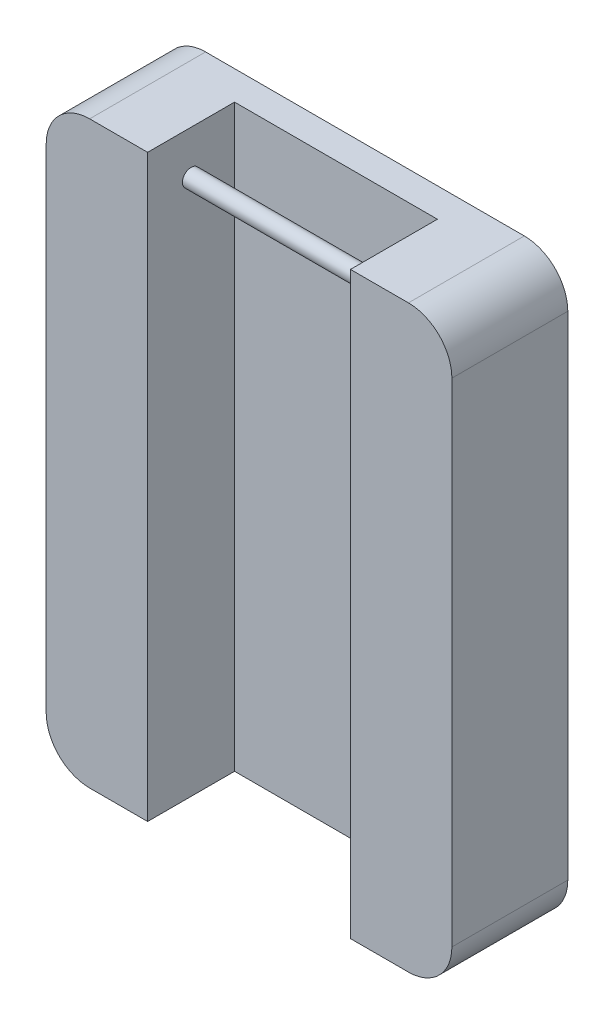
ISO-10303-21;
HEADER;
FILE_DESCRIPTION(('STEP AP214'),'2;1');
FILE_NAME('part.step','',(''),(''),'','','');
FILE_SCHEMA(('AUTOMOTIVE_DESIGN { 1 0 10303 214 1 1 1 1 }'));
ENDSEC;
DATA;
#1=APPLICATION_CONTEXT('core data for automotive mechanical design processes');
#2=APPLICATION_PROTOCOL_DEFINITION('international standard','automotive_design',2000,#1);
#3=PRODUCT_CONTEXT('',#1,'mechanical');
#4=PRODUCT('Part','Part','',(#3));
#5=PRODUCT_RELATED_PRODUCT_CATEGORY('part','',(#4));
#6=PRODUCT_DEFINITION_FORMATION('','',#4);
#7=PRODUCT_DEFINITION_CONTEXT('part definition',#1,'design');
#8=PRODUCT_DEFINITION('design','',#6,#7);
#9=PRODUCT_DEFINITION_SHAPE('','',#8);
#10=(LENGTH_UNIT() NAMED_UNIT(*) SI_UNIT(.MILLI.,.METRE.));
#11=(NAMED_UNIT(*) PLANE_ANGLE_UNIT() SI_UNIT($,.RADIAN.));
#12=(NAMED_UNIT(*) SI_UNIT($,.STERADIAN.) SOLID_ANGLE_UNIT());
#13=UNCERTAINTY_MEASURE_WITH_UNIT(LENGTH_MEASURE(1.E-05),#10,'distance_accuracy_value','');
#14=(GEOMETRIC_REPRESENTATION_CONTEXT(3) GLOBAL_UNCERTAINTY_ASSIGNED_CONTEXT((#13)) GLOBAL_UNIT_ASSIGNED_CONTEXT((#10,
#11,#12)) REPRESENTATION_CONTEXT('',''));
#15=CARTESIAN_POINT('',(0.,0.,0.));
#16=DIRECTION('',(0.,0.,1.));
#17=DIRECTION('',(1.,0.,0.));
#18=AXIS2_PLACEMENT_3D('',#15,#16,#17);
#19=CARTESIAN_POINT('',(-55.,85.,40.));
#20=DIRECTION('',(0.,0.,-1.));
#21=DIRECTION('',(-1.,0.,0.));
#22=AXIS2_PLACEMENT_3D('',#19,#20,#21);
#23=PLANE('',#22);
#24=DIRECTION('',(-1.,0.,0.));
#25=VECTOR('',#24,1.);
#26=CARTESIAN_POINT('',(54.9999999999999,100.,40.));
#27=LINE('',#26,#25);
#28=CARTESIAN_POINT('',(54.9999999999999,100.,40.));
#29=VERTEX_POINT('',#28);
#30=CARTESIAN_POINT('',(35.,100.,40.));
#31=VERTEX_POINT('',#30);
#32=EDGE_CURVE('E221',#29,#31,#27,.T.);
#33=ORIENTED_EDGE('',*,*,#32,.T.);
#34=DIRECTION('',(0.,1.,0.));
#35=VECTOR('',#34,1.);
#36=CARTESIAN_POINT('',(35.,-100.,40.));
#37=LINE('',#36,#35);
#38=CARTESIAN_POINT('',(35.,-100.,40.));
#39=VERTEX_POINT('',#38);
#40=EDGE_CURVE('E200',#39,#31,#37,.T.);
#41=ORIENTED_EDGE('',*,*,#40,.F.);
#42=DIRECTION('',(1.,0.,0.));
#43=VECTOR('',#42,1.);
#44=CARTESIAN_POINT('',(-54.9999999999999,-100.,40.));
#45=LINE('',#44,#43);
#46=CARTESIAN_POINT('',(54.9999999999999,-100.,40.));
#47=VERTEX_POINT('',#46);
#48=EDGE_CURVE('E125',#39,#47,#45,.T.);
#49=ORIENTED_EDGE('',*,*,#48,.T.);
#50=CARTESIAN_POINT('',(55.,-85.,40.));
#51=DIRECTION('',(0.,0.,1.));
#52=DIRECTION('',(1.,0.,0.));
#53=AXIS2_PLACEMENT_3D('',#50,#51,#52);
#54=CIRCLE('',#53,15.);
#55=CARTESIAN_POINT('',(70.,-85.,40.));
#56=VERTEX_POINT('',#55);
#57=EDGE_CURVE('E118',#47,#56,#54,.T.);
#58=ORIENTED_EDGE('',*,*,#57,.T.);
#59=DIRECTION('',(0.,1.,0.));
#60=VECTOR('',#59,1.);
#61=CARTESIAN_POINT('',(70.,-84.9999999999999,40.));
#62=LINE('',#61,#60);
#63=CARTESIAN_POINT('',(70.,84.9999999999999,40.));
#64=VERTEX_POINT('',#63);
#65=EDGE_CURVE('E121',#56,#64,#62,.T.);
#66=ORIENTED_EDGE('',*,*,#65,.T.);
#67=CARTESIAN_POINT('',(55.,85.,40.));
#68=DIRECTION('',(0.,0.,1.));
#69=DIRECTION('',(1.,0.,0.));
#70=AXIS2_PLACEMENT_3D('',#67,#68,#69);
#71=CIRCLE('',#70,15.);
#72=EDGE_CURVE('E60',#64,#29,#71,.T.);
#73=ORIENTED_EDGE('',*,*,#72,.T.);
#74=EDGE_LOOP('',(#33,#41,#49,#58,#66,#73));
#75=FACE_BOUND('',#74,.T.);
#76=ADVANCED_FACE('F35',(#75),#23,.F.);
#77=CARTESIAN_POINT('',(0.,100.,40.));
#78=DIRECTION('',(0.,-1.,0.));
#79=DIRECTION('',(0.,0.,-1.));
#80=AXIS2_PLACEMENT_3D('',#77,#78,#79);
#81=PLANE('',#80);
#82=DIRECTION('',(-1.,0.,0.));
#83=VECTOR('',#82,1.);
#84=CARTESIAN_POINT('',(35.,100.,10.));
#85=LINE('',#84,#83);
#86=CARTESIAN_POINT('',(35.,100.,10.));
#87=VERTEX_POINT('',#86);
#88=CARTESIAN_POINT('',(-35.,100.,10.));
#89=VERTEX_POINT('',#88);
#90=EDGE_CURVE('E230',#87,#89,#85,.T.);
#91=ORIENTED_EDGE('',*,*,#90,.F.);
#92=DIRECTION('',(0.,0.,1.));
#93=VECTOR('',#92,1.);
#94=CARTESIAN_POINT('',(35.,100.,10.));
#95=LINE('',#94,#93);
#96=EDGE_CURVE('E150',#87,#31,#95,.T.);
#97=ORIENTED_EDGE('',*,*,#96,.T.);
#98=ORIENTED_EDGE('',*,*,#32,.F.);
#99=DIRECTION('',(0.,0.,-1.));
#100=VECTOR('',#99,1.);
#101=CARTESIAN_POINT('',(54.9999999999999,100.,40.));
#102=LINE('',#101,#100);
#103=CARTESIAN_POINT('',(54.9999999999999,100.,0.));
#104=VERTEX_POINT('',#103);
#105=EDGE_CURVE('E144',#29,#104,#102,.T.);
#106=ORIENTED_EDGE('',*,*,#105,.T.);
#107=DIRECTION('',(-1.,0.,0.));
#108=VECTOR('',#107,1.);
#109=CARTESIAN_POINT('',(0.,100.,0.));
#110=LINE('',#109,#108);
#111=CARTESIAN_POINT('',(-54.9999999999999,100.,0.));
#112=VERTEX_POINT('',#111);
#113=EDGE_CURVE('E93',#104,#112,#110,.T.);
#114=ORIENTED_EDGE('',*,*,#113,.T.);
#115=DIRECTION('',(0.,0.,-1.));
#116=VECTOR('',#115,1.);
#117=CARTESIAN_POINT('',(-54.9999999999999,100.,40.));
#118=LINE('',#117,#116);
#119=CARTESIAN_POINT('',(-54.9999999999999,100.,40.));
#120=VERTEX_POINT('',#119);
#121=EDGE_CURVE('E175',#120,#112,#118,.T.);
#122=ORIENTED_EDGE('',*,*,#121,.F.);
#123=CARTESIAN_POINT('',(-35.,100.,40.));
#124=VERTEX_POINT('',#123);
#125=EDGE_CURVE('E101',#124,#120,#27,.T.);
#126=ORIENTED_EDGE('',*,*,#125,.F.);
#127=DIRECTION('',(0.,0.,1.));
#128=VECTOR('',#127,1.);
#129=CARTESIAN_POINT('',(-35.,100.,10.));
#130=LINE('',#129,#128);
#131=EDGE_CURVE('E51',#89,#124,#130,.T.);
#132=ORIENTED_EDGE('',*,*,#131,.F.);
#133=EDGE_LOOP('',(#91,#97,#98,#106,#114,#122,#126,#132));
#134=FACE_BOUND('',#133,.T.);
#135=ADVANCED_FACE('F37',(#134),#81,.F.);
#136=CARTESIAN_POINT('',(-55.,85.,40.));
#137=DIRECTION('',(0.,0.,-1.));
#138=DIRECTION('',(-1.,0.,0.));
#139=AXIS2_PLACEMENT_3D('',#136,#137,#138);
#140=CYLINDRICAL_SURFACE('',#139,15.);
#141=CARTESIAN_POINT('',(-55.,85.,0.));
#142=DIRECTION('',(0.,0.,1.));
#143=DIRECTION('',(-1.,0.,0.));
#144=AXIS2_PLACEMENT_3D('',#141,#142,#143);
#145=CIRCLE('',#144,15.);
#146=CARTESIAN_POINT('',(-70.,84.9999999999999,0.));
#147=VERTEX_POINT('',#146);
#148=EDGE_CURVE('E149',#112,#147,#145,.T.);
#149=ORIENTED_EDGE('',*,*,#148,.T.);
#150=DIRECTION('',(0.,0.,-1.));
#151=VECTOR('',#150,1.);
#152=CARTESIAN_POINT('',(-70.,84.9999999999999,40.));
#153=LINE('',#152,#151);
#154=CARTESIAN_POINT('',(-70.,84.9999999999999,40.));
#155=VERTEX_POINT('',#154);
#156=EDGE_CURVE('E173',#155,#147,#153,.T.);
#157=ORIENTED_EDGE('',*,*,#156,.F.);
#158=CARTESIAN_POINT('',(-55.,85.,40.));
#159=DIRECTION('',(0.,0.,1.));
#160=DIRECTION('',(-1.,0.,0.));
#161=AXIS2_PLACEMENT_3D('',#158,#159,#160);
#162=CIRCLE('',#161,15.);
#163=EDGE_CURVE('E219',#120,#155,#162,.T.);
#164=ORIENTED_EDGE('',*,*,#163,.F.);
#165=ORIENTED_EDGE('',*,*,#121,.T.);
#166=EDGE_LOOP('',(#149,#157,#164,#165));
#167=FACE_BOUND('',#166,.T.);
#168=ADVANCED_FACE('F245',(#167),#140,.T.);
#169=CARTESIAN_POINT('',(-70.,84.9999999999999,40.));
#170=DIRECTION('',(1.,0.,0.));
#171=DIRECTION('',(0.,0.,-1.));
#172=AXIS2_PLACEMENT_3D('',#169,#170,#171);
#173=PLANE('',#172);
#174=DIRECTION('',(0.,-1.,0.));
#175=VECTOR('',#174,1.);
#176=CARTESIAN_POINT('',(-70.,84.9999999999999,0.));
#177=LINE('',#176,#175);
#178=CARTESIAN_POINT('',(-70.,-84.9999999999999,0.));
#179=VERTEX_POINT('',#178);
#180=EDGE_CURVE('E152',#147,#179,#177,.T.);
#181=ORIENTED_EDGE('',*,*,#180,.T.);
#182=DIRECTION('',(0.,0.,-1.));
#183=VECTOR('',#182,1.);
#184=CARTESIAN_POINT('',(-70.,-84.9999999999999,40.));
#185=LINE('',#184,#183);
#186=CARTESIAN_POINT('',(-70.,-84.9999999999999,40.));
#187=VERTEX_POINT('',#186);
#188=EDGE_CURVE('E170',#187,#179,#185,.T.);
#189=ORIENTED_EDGE('',*,*,#188,.F.);
#190=DIRECTION('',(0.,-1.,0.));
#191=VECTOR('',#190,1.);
#192=CARTESIAN_POINT('',(-70.,84.9999999999999,40.));
#193=LINE('',#192,#191);
#194=EDGE_CURVE('E217',#155,#187,#193,.T.);
#195=ORIENTED_EDGE('',*,*,#194,.F.);
#196=ORIENTED_EDGE('',*,*,#156,.T.);
#197=EDGE_LOOP('',(#181,#189,#195,#196));
#198=FACE_BOUND('',#197,.T.);
#199=ADVANCED_FACE('F249',(#198),#173,.F.);
#200=CARTESIAN_POINT('',(-55.,-85.,40.));
#201=DIRECTION('',(0.,0.,-1.));
#202=DIRECTION('',(-1.,0.,0.));
#203=AXIS2_PLACEMENT_3D('',#200,#201,#202);
#204=CYLINDRICAL_SURFACE('',#203,15.);
#205=CARTESIAN_POINT('',(-55.,-85.,0.));
#206=DIRECTION('',(0.,0.,1.));
#207=DIRECTION('',(1.,0.,0.));
#208=AXIS2_PLACEMENT_3D('',#205,#206,#207);
#209=CIRCLE('',#208,15.);
#210=CARTESIAN_POINT('',(-54.9999999999999,-100.,0.));
#211=VERTEX_POINT('',#210);
#212=EDGE_CURVE('E154',#179,#211,#209,.T.);
#213=ORIENTED_EDGE('',*,*,#212,.T.);
#214=DIRECTION('',(0.,0.,-1.));
#215=VECTOR('',#214,1.);
#216=CARTESIAN_POINT('',(-54.9999999999999,-100.,40.));
#217=LINE('',#216,#215);
#218=CARTESIAN_POINT('',(-54.9999999999999,-100.,40.));
#219=VERTEX_POINT('',#218);
#220=EDGE_CURVE('E167',#219,#211,#217,.T.);
#221=ORIENTED_EDGE('',*,*,#220,.F.);
#222=CARTESIAN_POINT('',(-55.,-85.,40.));
#223=DIRECTION('',(0.,0.,1.));
#224=DIRECTION('',(1.,0.,0.));
#225=AXIS2_PLACEMENT_3D('',#222,#223,#224);
#226=CIRCLE('',#225,15.);
#227=EDGE_CURVE('E213',#187,#219,#226,.T.);
#228=ORIENTED_EDGE('',*,*,#227,.F.);
#229=ORIENTED_EDGE('',*,*,#188,.T.);
#230=EDGE_LOOP('',(#213,#221,#228,#229));
#231=FACE_BOUND('',#230,.T.);
#232=ADVANCED_FACE('F253',(#231),#204,.T.);
#233=CARTESIAN_POINT('',(-54.9999999999999,-100.,40.));
#234=DIRECTION('',(0.,1.,0.));
#235=DIRECTION('',(0.,0.,1.));
#236=AXIS2_PLACEMENT_3D('',#233,#234,#235);
#237=PLANE('',#236);
#238=ORIENTED_EDGE('',*,*,#48,.F.);
#239=DIRECTION('',(0.,0.,1.));
#240=VECTOR('',#239,1.);
#241=CARTESIAN_POINT('',(35.,-100.,10.));
#242=LINE('',#241,#240);
#243=CARTESIAN_POINT('',(35.,-100.,10.));
#244=VERTEX_POINT('',#243);
#245=EDGE_CURVE('E209',#244,#39,#242,.T.);
#246=ORIENTED_EDGE('',*,*,#245,.F.);
#247=DIRECTION('',(1.,0.,0.));
#248=VECTOR('',#247,1.);
#249=CARTESIAN_POINT('',(-35.,-100.,10.));
#250=LINE('',#249,#248);
#251=CARTESIAN_POINT('',(-35.,-100.,10.));
#252=VERTEX_POINT('',#251);
#253=EDGE_CURVE('E208',#252,#244,#250,.T.);
#254=ORIENTED_EDGE('',*,*,#253,.F.);
#255=DIRECTION('',(0.,0.,1.));
#256=VECTOR('',#255,1.);
#257=CARTESIAN_POINT('',(-35.,-100.,10.));
#258=LINE('',#257,#256);
#259=CARTESIAN_POINT('',(-35.,-100.,40.));
#260=VERTEX_POINT('',#259);
#261=EDGE_CURVE('E195',#252,#260,#258,.T.);
#262=ORIENTED_EDGE('',*,*,#261,.T.);
#263=EDGE_CURVE('E129',#219,#260,#45,.T.);
#264=ORIENTED_EDGE('',*,*,#263,.F.);
#265=ORIENTED_EDGE('',*,*,#220,.T.);
#266=DIRECTION('',(1.,0.,0.));
#267=VECTOR('',#266,1.);
#268=CARTESIAN_POINT('',(-54.9999999999999,-100.,0.));
#269=LINE('',#268,#267);
#270=CARTESIAN_POINT('',(54.9999999999999,-100.,0.));
#271=VERTEX_POINT('',#270);
#272=EDGE_CURVE('E156',#211,#271,#269,.T.);
#273=ORIENTED_EDGE('',*,*,#272,.T.);
#274=DIRECTION('',(0.,0.,-1.));
#275=VECTOR('',#274,1.);
#276=CARTESIAN_POINT('',(54.9999999999999,-100.,40.));
#277=LINE('',#276,#275);
#278=EDGE_CURVE('E138',#47,#271,#277,.T.);
#279=ORIENTED_EDGE('',*,*,#278,.F.);
#280=EDGE_LOOP('',(#238,#246,#254,#262,#264,#265,#273,#279));
#281=FACE_BOUND('',#280,.T.);
#282=ADVANCED_FACE('F205',(#281),#237,.F.);
#283=CARTESIAN_POINT('',(55.,-85.,40.));
#284=DIRECTION('',(0.,0.,-1.));
#285=DIRECTION('',(-1.,0.,0.));
#286=AXIS2_PLACEMENT_3D('',#283,#284,#285);
#287=CYLINDRICAL_SURFACE('',#286,15.);
#288=CARTESIAN_POINT('',(55.,-85.,0.));
#289=DIRECTION('',(0.,0.,1.));
#290=DIRECTION('',(1.,0.,0.));
#291=AXIS2_PLACEMENT_3D('',#288,#289,#290);
#292=CIRCLE('',#291,15.);
#293=CARTESIAN_POINT('',(70.,-85.,0.));
#294=VERTEX_POINT('',#293);
#295=EDGE_CURVE('E135',#271,#294,#292,.T.);
#296=ORIENTED_EDGE('',*,*,#295,.T.);
#297=DIRECTION('',(0.,0.,-1.));
#298=VECTOR('',#297,1.);
#299=CARTESIAN_POINT('',(70.,-85.,40.));
#300=LINE('',#299,#298);
#301=EDGE_CURVE('E132',#56,#294,#300,.T.);
#302=ORIENTED_EDGE('',*,*,#301,.F.);
#303=ORIENTED_EDGE('',*,*,#57,.F.);
#304=ORIENTED_EDGE('',*,*,#278,.T.);
#305=EDGE_LOOP('',(#296,#302,#303,#304));
#306=FACE_BOUND('',#305,.T.);
#307=ADVANCED_FACE('F133',(#306),#287,.T.);
#308=CARTESIAN_POINT('',(70.,-84.9999999999999,40.));
#309=DIRECTION('',(-1.,0.,0.));
#310=DIRECTION('',(0.,0.,1.));
#311=AXIS2_PLACEMENT_3D('',#308,#309,#310);
#312=PLANE('',#311);
#313=DIRECTION('',(0.,1.,0.));
#314=VECTOR('',#313,1.);
#315=CARTESIAN_POINT('',(70.,-84.9999999999999,0.));
#316=LINE('',#315,#314);
#317=CARTESIAN_POINT('',(70.,84.9999999999999,0.));
#318=VERTEX_POINT('',#317);
#319=EDGE_CURVE('E159',#294,#318,#316,.T.);
#320=ORIENTED_EDGE('',*,*,#319,.T.);
#321=DIRECTION('',(0.,0.,-1.));
#322=VECTOR('',#321,1.);
#323=CARTESIAN_POINT('',(70.,84.9999999999999,40.));
#324=LINE('',#323,#322);
#325=EDGE_CURVE('E139',#64,#318,#324,.T.);
#326=ORIENTED_EDGE('',*,*,#325,.F.);
#327=ORIENTED_EDGE('',*,*,#65,.F.);
#328=ORIENTED_EDGE('',*,*,#301,.T.);
#329=EDGE_LOOP('',(#320,#326,#327,#328));
#330=FACE_BOUND('',#329,.T.);
#331=ADVANCED_FACE('F141',(#330),#312,.F.);
#332=CARTESIAN_POINT('',(55.,85.,40.));
#333=DIRECTION('',(0.,0.,-1.));
#334=DIRECTION('',(-1.,0.,0.));
#335=AXIS2_PLACEMENT_3D('',#332,#333,#334);
#336=CYLINDRICAL_SURFACE('',#335,15.);
#337=CARTESIAN_POINT('',(55.,85.,0.));
#338=DIRECTION('',(0.,0.,1.));
#339=DIRECTION('',(1.,0.,0.));
#340=AXIS2_PLACEMENT_3D('',#337,#338,#339);
#341=CIRCLE('',#340,15.);
#342=EDGE_CURVE('E161',#318,#104,#341,.T.);
#343=ORIENTED_EDGE('',*,*,#342,.T.);
#344=ORIENTED_EDGE('',*,*,#105,.F.);
#345=ORIENTED_EDGE('',*,*,#72,.F.);
#346=ORIENTED_EDGE('',*,*,#325,.T.);
#347=EDGE_LOOP('',(#343,#344,#345,#346));
#348=FACE_BOUND('',#347,.T.);
#349=ADVANCED_FACE('F257',(#348),#336,.T.);
#350=ORIENTED_EDGE('',*,*,#263,.T.);
#351=DIRECTION('',(0.,-1.,0.));
#352=VECTOR('',#351,1.);
#353=CARTESIAN_POINT('',(-35.,100.,40.));
#354=LINE('',#353,#352);
#355=EDGE_CURVE('E192',#124,#260,#354,.T.);
#356=ORIENTED_EDGE('',*,*,#355,.F.);
#357=ORIENTED_EDGE('',*,*,#125,.T.);
#358=ORIENTED_EDGE('',*,*,#163,.T.);
#359=ORIENTED_EDGE('',*,*,#194,.T.);
#360=ORIENTED_EDGE('',*,*,#227,.T.);
#361=EDGE_LOOP('',(#350,#356,#357,#358,#359,#360));
#362=FACE_BOUND('',#361,.T.);
#363=ADVANCED_FACE('F211',(#362),#23,.F.);
#364=CARTESIAN_POINT('',(-55.,85.,0.));
#365=DIRECTION('',(0.,0.,-1.));
#366=DIRECTION('',(-1.,0.,0.));
#367=AXIS2_PLACEMENT_3D('',#364,#365,#366);
#368=PLANE('',#367);
#369=ORIENTED_EDGE('',*,*,#113,.F.);
#370=ORIENTED_EDGE('',*,*,#342,.F.);
#371=ORIENTED_EDGE('',*,*,#319,.F.);
#372=ORIENTED_EDGE('',*,*,#295,.F.);
#373=ORIENTED_EDGE('',*,*,#272,.F.);
#374=ORIENTED_EDGE('',*,*,#212,.F.);
#375=ORIENTED_EDGE('',*,*,#180,.F.);
#376=ORIENTED_EDGE('',*,*,#148,.F.);
#377=EDGE_LOOP('',(#369,#370,#371,#372,#373,#374,#375,#376));
#378=FACE_BOUND('',#377,.T.);
#379=ADVANCED_FACE('F255',(#378),#368,.T.);
#380=CARTESIAN_POINT('',(35.,-100.,10.));
#381=DIRECTION('',(1.,0.,0.));
#382=DIRECTION('',(0.,0.,-1.));
#383=AXIS2_PLACEMENT_3D('',#380,#381,#382);
#384=PLANE('',#383);
#385=CARTESIAN_POINT('',(35.,85.,25.));
#386=DIRECTION('',(1.,0.,0.));
#387=DIRECTION('',(0.,0.,-1.));
#388=AXIS2_PLACEMENT_3D('',#385,#386,#387);
#389=CIRCLE('',#388,3.);
#390=CARTESIAN_POINT('',(35.,85.,22.));
#391=VERTEX_POINT('',#390);
#392=EDGE_CURVE('E11',#391,#391,#389,.F.);
#393=ORIENTED_EDGE('',*,*,#392,.F.);
#394=EDGE_LOOP('',(#393));
#395=FACE_BOUND('',#394,.T.);
#396=ORIENTED_EDGE('',*,*,#40,.T.);
#397=ORIENTED_EDGE('',*,*,#96,.F.);
#398=DIRECTION('',(0.,1.,0.));
#399=VECTOR('',#398,1.);
#400=CARTESIAN_POINT('',(35.,-100.,10.));
#401=LINE('',#400,#399);
#402=EDGE_CURVE('E223',#244,#87,#401,.T.);
#403=ORIENTED_EDGE('',*,*,#402,.F.);
#404=ORIENTED_EDGE('',*,*,#245,.T.);
#405=EDGE_LOOP('',(#396,#397,#403,#404));
#406=FACE_BOUND('',#405,.T.);
#407=ADVANCED_FACE('F188',(#395,#406),#384,.F.);
#408=CARTESIAN_POINT('',(-35.,100.,10.));
#409=DIRECTION('',(-1.,0.,0.));
#410=DIRECTION('',(0.,0.,1.));
#411=AXIS2_PLACEMENT_3D('',#408,#409,#410);
#412=PLANE('',#411);
#413=CARTESIAN_POINT('',(-35.,85.,25.));
#414=DIRECTION('',(-1.,0.,0.));
#415=DIRECTION('',(0.,0.,1.));
#416=AXIS2_PLACEMENT_3D('',#413,#414,#415);
#417=CIRCLE('',#416,3.);
#418=CARTESIAN_POINT('',(-35.,85.,28.));
#419=VERTEX_POINT('',#418);
#420=EDGE_CURVE('E39',#419,#419,#417,.F.);
#421=ORIENTED_EDGE('',*,*,#420,.F.);
#422=EDGE_LOOP('',(#421));
#423=FACE_BOUND('',#422,.T.);
#424=ORIENTED_EDGE('',*,*,#355,.T.);
#425=ORIENTED_EDGE('',*,*,#261,.F.);
#426=DIRECTION('',(0.,-1.,0.));
#427=VECTOR('',#426,1.);
#428=CARTESIAN_POINT('',(-35.,100.,10.));
#429=LINE('',#428,#427);
#430=EDGE_CURVE('E235',#89,#252,#429,.T.);
#431=ORIENTED_EDGE('',*,*,#430,.F.);
#432=ORIENTED_EDGE('',*,*,#131,.T.);
#433=EDGE_LOOP('',(#424,#425,#431,#432));
#434=FACE_BOUND('',#433,.T.);
#435=ADVANCED_FACE('F185',(#423,#434),#412,.F.);
#436=CARTESIAN_POINT('',(0.,0.,10.));
#437=DIRECTION('',(0.,0.,1.));
#438=DIRECTION('',(1.,0.,0.));
#439=AXIS2_PLACEMENT_3D('',#436,#437,#438);
#440=PLANE('',#439);
#441=ORIENTED_EDGE('',*,*,#90,.T.);
#442=ORIENTED_EDGE('',*,*,#430,.T.);
#443=ORIENTED_EDGE('',*,*,#253,.T.);
#444=ORIENTED_EDGE('',*,*,#402,.T.);
#445=EDGE_LOOP('',(#441,#442,#443,#444));
#446=FACE_BOUND('',#445,.T.);
#447=ADVANCED_FACE('F187',(#446),#440,.T.);
#448=CARTESIAN_POINT('',(48.650089496397,85.,25.));
#449=DIRECTION('',(-1.,0.,0.));
#450=DIRECTION('',(0.,0.,1.));
#451=AXIS2_PLACEMENT_3D('',#448,#449,#450);
#452=CYLINDRICAL_SURFACE('',#451,3.);
#453=ORIENTED_EDGE('',*,*,#420,.T.);
#454=EDGE_LOOP('',(#453));
#455=FACE_BOUND('',#454,.T.);
#456=ORIENTED_EDGE('',*,*,#392,.T.);
#457=EDGE_LOOP('',(#456));
#458=FACE_BOUND('',#457,.T.);
#459=ADVANCED_FACE('F182',(#455,#458),#452,.T.);
#460=CLOSED_SHELL('',(#76,#135,#168,#199,#232,#282,#307,#331,#349,#363,#379,#407,#435,#447,#459));
#461=MANIFOLD_SOLID_BREP('B2',#460);
#462=ADVANCED_BREP_SHAPE_REPRESENTATION('',(#18,#461),#14);
#463=SHAPE_DEFINITION_REPRESENTATION(#9,#462);
ENDSEC;
END-ISO-10303-21;
